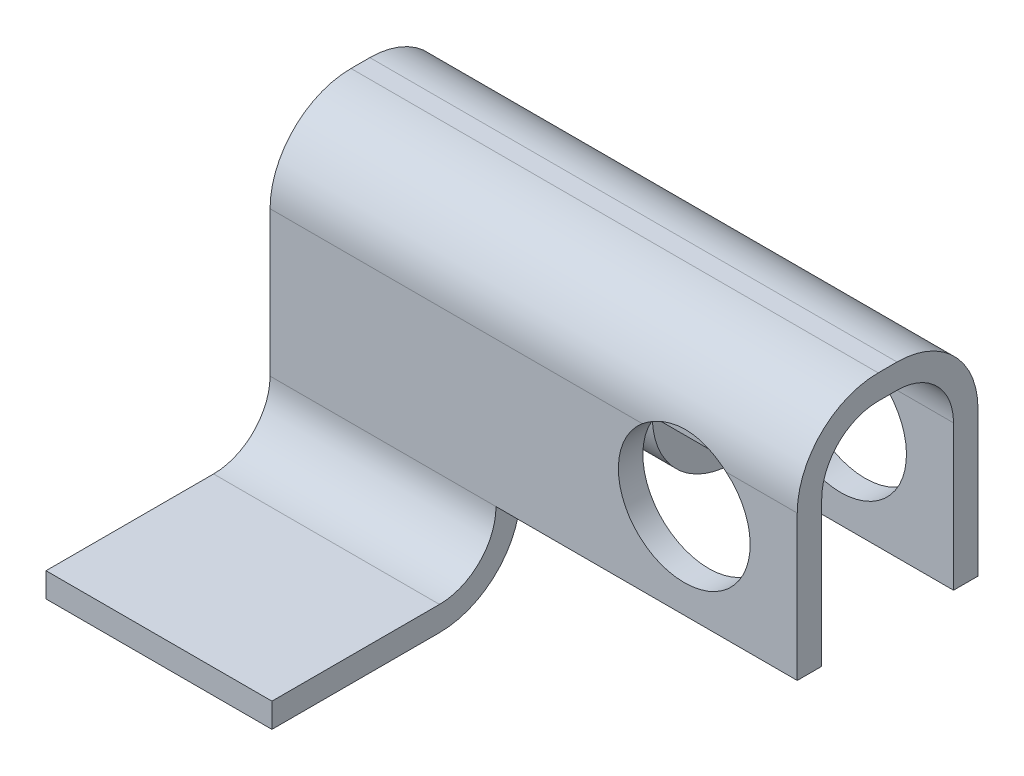
ISO-10303-21;
HEADER;
FILE_DESCRIPTION(('STEP AP214'),'2;1');
FILE_NAME('part.step','',(''),(''),'','','');
FILE_SCHEMA(('AUTOMOTIVE_DESIGN { 1 0 10303 214 1 1 1 1 }'));
ENDSEC;
DATA;
#1=APPLICATION_CONTEXT('core data for automotive mechanical design processes');
#2=APPLICATION_PROTOCOL_DEFINITION('international standard','automotive_design',2000,#1);
#3=PRODUCT_CONTEXT('',#1,'mechanical');
#4=PRODUCT('Part','Part','',(#3));
#5=PRODUCT_RELATED_PRODUCT_CATEGORY('part','',(#4));
#6=PRODUCT_DEFINITION_FORMATION('','',#4);
#7=PRODUCT_DEFINITION_CONTEXT('part definition',#1,'design');
#8=PRODUCT_DEFINITION('design','',#6,#7);
#9=PRODUCT_DEFINITION_SHAPE('','',#8);
#10=(LENGTH_UNIT() NAMED_UNIT(*) SI_UNIT(.MILLI.,.METRE.));
#11=(NAMED_UNIT(*) PLANE_ANGLE_UNIT() SI_UNIT($,.RADIAN.));
#12=(NAMED_UNIT(*) SI_UNIT($,.STERADIAN.) SOLID_ANGLE_UNIT());
#13=UNCERTAINTY_MEASURE_WITH_UNIT(LENGTH_MEASURE(1.E-05),#10,'distance_accuracy_value','');
#14=(GEOMETRIC_REPRESENTATION_CONTEXT(3) GLOBAL_UNCERTAINTY_ASSIGNED_CONTEXT((#13)) GLOBAL_UNIT_ASSIGNED_CONTEXT((#10,
#11,#12)) REPRESENTATION_CONTEXT('',''));
#15=CARTESIAN_POINT('',(0.,0.,0.));
#16=DIRECTION('',(0.,0.,1.));
#17=DIRECTION('',(1.,0.,0.));
#18=AXIS2_PLACEMENT_3D('',#15,#16,#17);
#19=CARTESIAN_POINT('',(14.,4.3,4.8));
#20=DIRECTION('',(0.,0.,-1.));
#21=DIRECTION('',(-1.,0.,0.));
#22=AXIS2_PLACEMENT_3D('',#19,#20,#21);
#23=PLANE('',#22);
#24=CARTESIAN_POINT('',(8.,9.3,4.8));
#25=DIRECTION('',(0.,0.,1.));
#26=DIRECTION('',(1.,0.,0.));
#27=AXIS2_PLACEMENT_3D('',#24,#25,#26);
#28=CIRCLE('',#27,3.5);
#29=CARTESIAN_POINT('',(5.77289425486799,12.,4.8));
#30=VERTEX_POINT('',#29);
#31=CARTESIAN_POINT('',(10.227105745132,12.,4.8));
#32=VERTEX_POINT('',#31);
#33=EDGE_CURVE('E64',#30,#32,#28,.T.);
#34=ORIENTED_EDGE('',*,*,#33,.F.);
#35=DIRECTION('',(-1.,0.,0.));
#36=VECTOR('',#35,1.);
#37=CARTESIAN_POINT('',(14.,12.,4.8));
#38=LINE('',#37,#36);
#39=CARTESIAN_POINT('',(-14.,12.,4.8));
#40=VERTEX_POINT('',#39);
#41=EDGE_CURVE('E280',#30,#40,#38,.T.);
#42=ORIENTED_EDGE('',*,*,#41,.T.);
#43=DIRECTION('',(0.,1.,0.));
#44=VECTOR('',#43,1.);
#45=CARTESIAN_POINT('',(-14.,4.3,4.8));
#46=LINE('',#45,#44);
#47=CARTESIAN_POINT('',(-14.,4.3,4.8));
#48=VERTEX_POINT('',#47);
#49=EDGE_CURVE('E402',#40,#48,#46,.F.);
#50=ORIENTED_EDGE('',*,*,#49,.T.);
#51=DIRECTION('',(-1.,0.,0.));
#52=VECTOR('',#51,1.);
#53=CARTESIAN_POINT('',(14.,4.3,4.8));
#54=LINE('',#53,#52);
#55=CARTESIAN_POINT('',(-2.,4.3,4.8));
#56=VERTEX_POINT('',#55);
#57=EDGE_CURVE('E298',#56,#48,#54,.T.);
#58=ORIENTED_EDGE('',*,*,#57,.F.);
#59=CARTESIAN_POINT('',(14.,4.3,4.8));
#60=VERTEX_POINT('',#59);
#61=EDGE_CURVE('E293',#60,#56,#54,.T.);
#62=ORIENTED_EDGE('',*,*,#61,.F.);
#63=DIRECTION('',(0.,1.,0.));
#64=VECTOR('',#63,1.);
#65=CARTESIAN_POINT('',(14.,4.3,4.8));
#66=LINE('',#65,#64);
#67=CARTESIAN_POINT('',(14.,12.,4.8));
#68=VERTEX_POINT('',#67);
#69=EDGE_CURVE('E386',#68,#60,#66,.F.);
#70=ORIENTED_EDGE('',*,*,#69,.F.);
#71=EDGE_CURVE('E283',#68,#32,#38,.T.);
#72=ORIENTED_EDGE('',*,*,#71,.T.);
#73=EDGE_LOOP('',(#34,#42,#50,#58,#62,#70,#72));
#74=FACE_BOUND('',#73,.T.);
#75=ADVANCED_FACE('F41',(#74),#23,.F.);
#76=CARTESIAN_POINT('',(14.,1.3,16.7));
#77=DIRECTION('',(0.,-1.,0.));
#78=DIRECTION('',(0.,0.,-1.));
#79=AXIS2_PLACEMENT_3D('',#76,#77,#78);
#80=PLANE('',#79);
#81=DIRECTION('',(-1.,0.,0.));
#82=VECTOR('',#81,1.);
#83=CARTESIAN_POINT('',(14.,1.3,16.7));
#84=LINE('',#83,#82);
#85=CARTESIAN_POINT('',(-2.,1.3,16.7));
#86=VERTEX_POINT('',#85);
#87=CARTESIAN_POINT('',(-14.,1.3,16.7));
#88=VERTEX_POINT('',#87);
#89=EDGE_CURVE('E361',#86,#88,#84,.T.);
#90=ORIENTED_EDGE('',*,*,#89,.F.);
#91=DIRECTION('',(0.,0.,-1.));
#92=VECTOR('',#91,1.);
#93=CARTESIAN_POINT('',(-2.,1.3,16.7));
#94=LINE('',#93,#92);
#95=CARTESIAN_POINT('',(-2.,1.3,7.8));
#96=VERTEX_POINT('',#95);
#97=EDGE_CURVE('E513',#86,#96,#94,.T.);
#98=ORIENTED_EDGE('',*,*,#97,.T.);
#99=DIRECTION('',(-1.,0.,0.));
#100=VECTOR('',#99,1.);
#101=CARTESIAN_POINT('',(14.,1.3,7.8));
#102=LINE('',#101,#100);
#103=CARTESIAN_POINT('',(-14.,1.3,7.8));
#104=VERTEX_POINT('',#103);
#105=EDGE_CURVE('E432',#96,#104,#102,.T.);
#106=ORIENTED_EDGE('',*,*,#105,.T.);
#107=DIRECTION('',(0.,0.,-1.));
#108=VECTOR('',#107,1.);
#109=CARTESIAN_POINT('',(-14.,1.3,16.7));
#110=LINE('',#109,#108);
#111=EDGE_CURVE('E433',#104,#88,#110,.F.);
#112=ORIENTED_EDGE('',*,*,#111,.T.);
#113=EDGE_LOOP('',(#90,#98,#106,#112));
#114=FACE_BOUND('',#113,.T.);
#115=ADVANCED_FACE('F43',(#114),#80,.F.);
#116=CARTESIAN_POINT('',(14.,0.,16.7));
#117=DIRECTION('',(0.,0.,1.));
#118=DIRECTION('',(1.,0.,0.));
#119=AXIS2_PLACEMENT_3D('',#116,#117,#118);
#120=PLANE('',#119);
#121=DIRECTION('',(0.,1.,0.));
#122=VECTOR('',#121,1.);
#123=CARTESIAN_POINT('',(-2.,0.,16.7));
#124=LINE('',#123,#122);
#125=CARTESIAN_POINT('',(-2.,0.,16.7));
#126=VERTEX_POINT('',#125);
#127=EDGE_CURVE('E518',#126,#86,#124,.T.);
#128=ORIENTED_EDGE('',*,*,#127,.T.);
#129=ORIENTED_EDGE('',*,*,#89,.T.);
#130=DIRECTION('',(0.,1.,0.));
#131=VECTOR('',#130,1.);
#132=CARTESIAN_POINT('',(-14.,0.,16.7));
#133=LINE('',#132,#131);
#134=CARTESIAN_POINT('',(-14.,0.,16.7));
#135=VERTEX_POINT('',#134);
#136=EDGE_CURVE('E437',#135,#88,#133,.T.);
#137=ORIENTED_EDGE('',*,*,#136,.F.);
#138=DIRECTION('',(-1.,0.,0.));
#139=VECTOR('',#138,1.);
#140=CARTESIAN_POINT('',(14.,0.,16.7));
#141=LINE('',#140,#139);
#142=EDGE_CURVE('E358',#126,#135,#141,.T.);
#143=ORIENTED_EDGE('',*,*,#142,.F.);
#144=EDGE_LOOP('',(#128,#129,#137,#143));
#145=FACE_BOUND('',#144,.T.);
#146=ADVANCED_FACE('F516',(#145),#120,.T.);
#147=CARTESIAN_POINT('',(14.,0.,16.7));
#148=DIRECTION('',(0.,-1.,0.));
#149=DIRECTION('',(0.,0.,-1.));
#150=AXIS2_PLACEMENT_3D('',#147,#148,#149);
#151=PLANE('',#150);
#152=DIRECTION('',(0.,0.,1.));
#153=VECTOR('',#152,1.);
#154=CARTESIAN_POINT('',(-2.,0.,16.7));
#155=LINE('',#154,#153);
#156=CARTESIAN_POINT('',(-2.,0.,7.8));
#157=VERTEX_POINT('',#156);
#158=EDGE_CURVE('E529',#157,#126,#155,.T.);
#159=ORIENTED_EDGE('',*,*,#158,.T.);
#160=ORIENTED_EDGE('',*,*,#142,.T.);
#161=DIRECTION('',(0.,0.,1.));
#162=VECTOR('',#161,1.);
#163=CARTESIAN_POINT('',(-14.,0.,16.7));
#164=LINE('',#163,#162);
#165=CARTESIAN_POINT('',(-14.,0.,7.8));
#166=VERTEX_POINT('',#165);
#167=EDGE_CURVE('E441',#166,#135,#164,.T.);
#168=ORIENTED_EDGE('',*,*,#167,.F.);
#169=DIRECTION('',(-1.,0.,0.));
#170=VECTOR('',#169,1.);
#171=CARTESIAN_POINT('',(14.,0.,7.8));
#172=LINE('',#171,#170);
#173=EDGE_CURVE('E355',#157,#166,#172,.T.);
#174=ORIENTED_EDGE('',*,*,#173,.F.);
#175=EDGE_LOOP('',(#159,#160,#168,#174));
#176=FACE_BOUND('',#175,.T.);
#177=ADVANCED_FACE('F672',(#176),#151,.T.);
#178=CARTESIAN_POINT('',(14.,4.3,7.8));
#179=DIRECTION('',(-1.,0.,0.));
#180=DIRECTION('',(0.,0.,1.));
#181=AXIS2_PLACEMENT_3D('',#178,#179,#180);
#182=CYLINDRICAL_SURFACE('',#181,4.3);
#183=CARTESIAN_POINT('',(-2.,4.3,7.8));
#184=DIRECTION('',(-1.,0.,0.));
#185=DIRECTION('',(0.,0.,1.));
#186=AXIS2_PLACEMENT_3D('',#183,#184,#185);
#187=CIRCLE('',#186,4.3);
#188=CARTESIAN_POINT('',(-2.,4.3,3.5));
#189=VERTEX_POINT('',#188);
#190=EDGE_CURVE('E405',#157,#189,#187,.F.);
#191=ORIENTED_EDGE('',*,*,#190,.F.);
#192=ORIENTED_EDGE('',*,*,#173,.T.);
#193=CARTESIAN_POINT('',(-14.,4.3,7.8));
#194=DIRECTION('',(-1.,0.,0.));
#195=DIRECTION('',(0.,0.,-1.));
#196=AXIS2_PLACEMENT_3D('',#193,#194,#195);
#197=CIRCLE('',#196,4.3);
#198=CARTESIAN_POINT('',(-14.,4.3,3.5));
#199=VERTEX_POINT('',#198);
#200=EDGE_CURVE('E445',#199,#166,#197,.T.);
#201=ORIENTED_EDGE('',*,*,#200,.F.);
#202=DIRECTION('',(-1.,0.,0.));
#203=VECTOR('',#202,1.);
#204=CARTESIAN_POINT('',(14.,4.3,3.5));
#205=LINE('',#204,#203);
#206=EDGE_CURVE('E350',#189,#199,#205,.T.);
#207=ORIENTED_EDGE('',*,*,#206,.F.);
#208=EDGE_LOOP('',(#191,#192,#201,#207));
#209=FACE_BOUND('',#208,.T.);
#210=ADVANCED_FACE('F558',(#209),#182,.T.);
#211=CARTESIAN_POINT('',(14.,4.3,3.5));
#212=DIRECTION('',(0.,0.,-1.));
#213=DIRECTION('',(-1.,0.,0.));
#214=AXIS2_PLACEMENT_3D('',#211,#212,#213);
#215=PLANE('',#214);
#216=CARTESIAN_POINT('',(8.,9.3,3.5));
#217=DIRECTION('',(0.,0.,-1.));
#218=DIRECTION('',(-1.,0.,0.));
#219=AXIS2_PLACEMENT_3D('',#216,#217,#218);
#220=CIRCLE('',#219,3.5);
#221=CARTESIAN_POINT('',(10.227105745132,12.,3.5));
#222=VERTEX_POINT('',#221);
#223=CARTESIAN_POINT('',(5.772894254868,12.,3.5));
#224=VERTEX_POINT('',#223);
#225=EDGE_CURVE('E570',#222,#224,#220,.T.);
#226=ORIENTED_EDGE('',*,*,#225,.F.);
#227=DIRECTION('',(-1.,0.,0.));
#228=VECTOR('',#227,1.);
#229=CARTESIAN_POINT('',(14.,12.,3.5));
#230=LINE('',#229,#228);
#231=CARTESIAN_POINT('',(14.,12.,3.5));
#232=VERTEX_POINT('',#231);
#233=EDGE_CURVE('E346',#232,#222,#230,.T.);
#234=ORIENTED_EDGE('',*,*,#233,.F.);
#235=DIRECTION('',(0.,-1.,0.));
#236=VECTOR('',#235,1.);
#237=CARTESIAN_POINT('',(14.,4.3,3.5));
#238=LINE('',#237,#236);
#239=CARTESIAN_POINT('',(14.,4.3,3.5));
#240=VERTEX_POINT('',#239);
#241=EDGE_CURVE('E384',#232,#240,#238,.T.);
#242=ORIENTED_EDGE('',*,*,#241,.T.);
#243=EDGE_CURVE('E351',#240,#189,#205,.T.);
#244=ORIENTED_EDGE('',*,*,#243,.T.);
#245=ORIENTED_EDGE('',*,*,#206,.T.);
#246=DIRECTION('',(0.,-1.,0.));
#247=VECTOR('',#246,1.);
#248=CARTESIAN_POINT('',(-14.,4.3,3.5));
#249=LINE('',#248,#247);
#250=CARTESIAN_POINT('',(-14.,12.,3.5));
#251=VERTEX_POINT('',#250);
#252=EDGE_CURVE('E449',#251,#199,#249,.T.);
#253=ORIENTED_EDGE('',*,*,#252,.F.);
#254=EDGE_CURVE('E345',#224,#251,#230,.T.);
#255=ORIENTED_EDGE('',*,*,#254,.F.);
#256=EDGE_LOOP('',(#226,#234,#242,#244,#245,#253,#255));
#257=FACE_BOUND('',#256,.T.);
#258=ADVANCED_FACE('F391',(#257),#215,.T.);
#259=CARTESIAN_POINT('',(14.,12.,0.5));
#260=DIRECTION('',(-1.,0.,0.));
#261=DIRECTION('',(0.,0.,1.));
#262=AXIS2_PLACEMENT_3D('',#259,#260,#261);
#263=CYLINDRICAL_SURFACE('',#262,3.);
#264=CARTESIAN_POINT('',(5.772894254868,12.,3.5));
#265=CARTESIAN_POINT('',(5.84796690042875,12.0619384017295,3.49998885328652));
#266=CARTESIAN_POINT('',(5.9256066170269,12.1207038565759,3.49808180727599));
#267=CARTESIAN_POINT('',(6.08539011545105,12.2315003259171,3.49157195603899));
#268=CARTESIAN_POINT('',(6.1675314978076,12.2835348793454,3.48697057451579));
#269=CARTESIAN_POINT('',(6.33581209672732,12.380572144154,3.47616298584188));
#270=CARTESIAN_POINT('',(6.42195335114828,12.4255712189601,3.46995595311597));
#271=CARTESIAN_POINT('',(6.59764903722375,12.5082451721521,3.45693083087825));
#272=CARTESIAN_POINT('',(6.68720388829673,12.5459191470328,3.45011266613847));
#273=CARTESIAN_POINT('',(6.86909883189998,12.6136802010811,3.43676505906119));
#274=CARTESIAN_POINT('',(6.96143720740045,12.6437718543924,3.4302354446218));
#275=CARTESIAN_POINT('',(7.14835757879908,12.6961928524743,3.41822542875842));
#276=CARTESIAN_POINT('',(7.24293949119757,12.7185224856482,3.41274498835505));
#277=CARTESIAN_POINT('',(7.43360402178837,12.755229251285,3.40344412618993));
#278=CARTESIAN_POINT('',(7.5296847797361,12.7696155425664,3.3996217936945));
#279=CARTESIAN_POINT('',(7.72276998303589,12.7903540060962,3.39403810388122));
#280=CARTESIAN_POINT('',(7.819774416712,12.7967062797651,3.39227672054621));
#281=CARTESIAN_POINT('',(8.0137129131286,12.8013129837278,3.39100387375256));
#282=CARTESIAN_POINT('',(8.1106463811826,12.7995905632813,3.39148597843138));
#283=CARTESIAN_POINT('',(8.30399916070207,12.7881178647135,3.39463378776338));
#284=CARTESIAN_POINT('',(8.40041846428964,12.7783674639433,3.3972995257774));
#285=CARTESIAN_POINT('',(8.59218753600681,12.7508989712738,3.40454019739066));
#286=CARTESIAN_POINT('',(8.68753561215619,12.7331697102432,3.40911780665605));
#287=CARTESIAN_POINT('',(8.87632310772877,12.6899048096135,3.41967785901132));
#288=CARTESIAN_POINT('',(8.96976256412049,12.6643693213683,3.42566027486308));
#289=CARTESIAN_POINT('',(9.24503006707725,12.5766905290595,3.444663674751));
#290=CARTESIAN_POINT('',(9.42338099924917,12.503246905692,3.45881918194043));
#291=CARTESIAN_POINT('',(9.67975291308119,12.3720793947057,3.47715801707161));
#292=CARTESIAN_POINT('',(9.7632842391686,12.3249059965885,3.48278496755195));
#293=CARTESIAN_POINT('',(9.92626858348999,12.2238081502256,3.49207174860834));
#294=CARTESIAN_POINT('',(10.0057238122775,12.16988741696,3.4957326558332));
#295=CARTESIAN_POINT('',(10.131903851002,12.0764598247996,3.4992446622574));
#296=CARTESIAN_POINT('',(10.1800180228962,12.0388476397168,3.49999733964808));
#297=CARTESIAN_POINT('',(10.227105745132,12.,3.5));
#298=B_SPLINE_CURVE_WITH_KNOTS('',3,(#264,#265,#266,#267,#268,#269,#270,#271,#272,#273,#274,
#275,#276,#277,#278,#279,#280,#281,#282,#283,#284,#285,#286,#287,#288,#289,#290,#291,#292,#293,
#294,#295,#296,#297),.UNSPECIFIED.,.F.,.F.,(4,2,2,2,2,2,2,2,2,2,2,2,2,2,2,2,4),(0.,
0.291819044565795,0.583484029146515,0.875299277775188,1.16715049718602,1.45882522937467,
1.75048912303015,2.04181601684805,2.33313923295286,2.62362776903662,2.91412074319535,
3.20502163216398,3.49591688125082,4.072986554689,4.36102755871018,4.64891066383744,
4.83203860166615),.UNSPECIFIED.);
#299=EDGE_CURVE('E567',#224,#222,#298,.T.);
#300=ORIENTED_EDGE('',*,*,#299,.F.);
#301=ORIENTED_EDGE('',*,*,#254,.T.);
#302=CARTESIAN_POINT('',(-14.,12.,0.5));
#303=DIRECTION('',(1.,0.,0.));
#304=DIRECTION('',(0.,0.,1.));
#305=AXIS2_PLACEMENT_3D('',#302,#303,#304);
#306=CIRCLE('',#305,3.);
#307=CARTESIAN_POINT('',(-14.,15.,0.5));
#308=VERTEX_POINT('',#307);
#309=EDGE_CURVE('E453',#308,#251,#306,.T.);
#310=ORIENTED_EDGE('',*,*,#309,.F.);
#311=DIRECTION('',(-1.,0.,0.));
#312=VECTOR('',#311,1.);
#313=CARTESIAN_POINT('',(14.,15.,0.5));
#314=LINE('',#313,#312);
#315=CARTESIAN_POINT('',(14.,15.,0.5));
#316=VERTEX_POINT('',#315);
#317=EDGE_CURVE('E342',#316,#308,#314,.T.);
#318=ORIENTED_EDGE('',*,*,#317,.F.);
#319=CARTESIAN_POINT('',(14.,12.,0.5));
#320=DIRECTION('',(1.,0.,0.));
#321=DIRECTION('',(0.,0.,1.));
#322=AXIS2_PLACEMENT_3D('',#319,#320,#321);
#323=CIRCLE('',#322,3.);
#324=EDGE_CURVE('E393',#316,#232,#323,.T.);
#325=ORIENTED_EDGE('',*,*,#324,.T.);
#326=ORIENTED_EDGE('',*,*,#233,.T.);
#327=EDGE_LOOP('',(#300,#301,#310,#318,#325,#326));
#328=FACE_BOUND('',#327,.T.);
#329=ADVANCED_FACE('F566',(#328),#263,.F.);
#330=CARTESIAN_POINT('',(14.,15.,0.5));
#331=DIRECTION('',(0.,-1.,0.));
#332=DIRECTION('',(0.,0.,-1.));
#333=AXIS2_PLACEMENT_3D('',#330,#331,#332);
#334=PLANE('',#333);
#335=DIRECTION('',(0.,0.,1.));
#336=VECTOR('',#335,1.);
#337=CARTESIAN_POINT('',(-14.,15.,0.5));
#338=LINE('',#337,#336);
#339=CARTESIAN_POINT('',(-14.,15.,-0.5));
#340=VERTEX_POINT('',#339);
#341=EDGE_CURVE('E457',#340,#308,#338,.T.);
#342=ORIENTED_EDGE('',*,*,#341,.F.);
#343=DIRECTION('',(-1.,0.,0.));
#344=VECTOR('',#343,1.);
#345=CARTESIAN_POINT('',(14.,15.,-0.5));
#346=LINE('',#345,#344);
#347=CARTESIAN_POINT('',(14.,15.,-0.5));
#348=VERTEX_POINT('',#347);
#349=EDGE_CURVE('E339',#348,#340,#346,.T.);
#350=ORIENTED_EDGE('',*,*,#349,.F.);
#351=DIRECTION('',(0.,0.,1.));
#352=VECTOR('',#351,1.);
#353=CARTESIAN_POINT('',(14.,15.,0.5));
#354=LINE('',#353,#352);
#355=EDGE_CURVE('E398',#348,#316,#354,.T.);
#356=ORIENTED_EDGE('',*,*,#355,.T.);
#357=ORIENTED_EDGE('',*,*,#317,.T.);
#358=EDGE_LOOP('',(#342,#350,#356,#357));
#359=FACE_BOUND('',#358,.T.);
#360=ADVANCED_FACE('F606',(#359),#334,.T.);
#361=CARTESIAN_POINT('',(14.,12.,-0.5));
#362=DIRECTION('',(-1.,0.,0.));
#363=DIRECTION('',(0.,0.,1.));
#364=AXIS2_PLACEMENT_3D('',#361,#362,#363);
#365=CYLINDRICAL_SURFACE('',#364,3.);
#366=CARTESIAN_POINT('',(10.227105745132,12.,-3.5));
#367=CARTESIAN_POINT('',(10.1520330995713,12.0619384017295,-3.49998885328652));
#368=CARTESIAN_POINT('',(10.0743933829731,12.1207038565759,-3.49808180727599));
#369=CARTESIAN_POINT('',(9.91460988454895,12.2315003259171,-3.49157195603899));
#370=CARTESIAN_POINT('',(9.8324685021924,12.2835348793454,-3.48697057451579));
#371=CARTESIAN_POINT('',(9.66418790327268,12.380572144154,-3.47616298584188));
#372=CARTESIAN_POINT('',(9.57804664885172,12.4255712189601,-3.46995595311597));
#373=CARTESIAN_POINT('',(9.40235096277625,12.5082451721521,-3.45693083087825));
#374=CARTESIAN_POINT('',(9.31279611170327,12.5459191470328,-3.45011266613847));
#375=CARTESIAN_POINT('',(9.13090116810002,12.6136802010811,-3.43676505906119));
#376=CARTESIAN_POINT('',(9.03856279259955,12.6437718543924,-3.4302354446218));
#377=CARTESIAN_POINT('',(8.85164242120092,12.6961928524743,-3.41822542875842));
#378=CARTESIAN_POINT('',(8.75706050880243,12.7185224856482,-3.41274498835505));
#379=CARTESIAN_POINT('',(8.56639597821163,12.755229251285,-3.40344412618993));
#380=CARTESIAN_POINT('',(8.4703152202639,12.7696155425664,-3.3996217936945));
#381=CARTESIAN_POINT('',(8.27723001696411,12.7903540060962,-3.39403810388122));
#382=CARTESIAN_POINT('',(8.180225583288,12.7967062797651,-3.39227672054621));
#383=CARTESIAN_POINT('',(7.9862870868714,12.8013129837278,-3.39100387375256));
#384=CARTESIAN_POINT('',(7.8893536188174,12.7995905632813,-3.39148597843138));
#385=CARTESIAN_POINT('',(7.69600083929793,12.7881178647135,-3.39463378776338));
#386=CARTESIAN_POINT('',(7.59958153571036,12.7783674639433,-3.3972995257774));
#387=CARTESIAN_POINT('',(7.40781246399319,12.7508989712738,-3.40454019739066));
#388=CARTESIAN_POINT('',(7.31246438784381,12.7331697102432,-3.40911780665605));
#389=CARTESIAN_POINT('',(7.12367689227123,12.6899048096135,-3.41967785901132));
#390=CARTESIAN_POINT('',(7.03023743587951,12.6643693213683,-3.42566027486308));
#391=CARTESIAN_POINT('',(6.75496993292275,12.5766905290595,-3.444663674751));
#392=CARTESIAN_POINT('',(6.57661900075084,12.503246905692,-3.45881918194043));
#393=CARTESIAN_POINT('',(6.32024708691881,12.3720793947057,-3.47715801707161));
#394=CARTESIAN_POINT('',(6.2367157608314,12.3249059965885,-3.48278496755194));
#395=CARTESIAN_POINT('',(6.07373141651001,12.2238081502256,-3.49207174860834));
#396=CARTESIAN_POINT('',(5.99427618772251,12.16988741696,-3.4957326558332));
#397=CARTESIAN_POINT('',(5.86809614899796,12.0764598247996,-3.4992446622574));
#398=CARTESIAN_POINT('',(5.81998197710382,12.0388476397168,-3.49999733964808));
#399=CARTESIAN_POINT('',(5.772894254868,12.,-3.5));
#400=B_SPLINE_CURVE_WITH_KNOTS('',3,(#366,#367,#368,#369,#370,#371,#372,#373,#374,#375,#376,
#377,#378,#379,#380,#381,#382,#383,#384,#385,#386,#387,#388,#389,#390,#391,#392,#393,#394,#395,
#396,#397,#398,#399),.UNSPECIFIED.,.F.,.F.,(4,2,2,2,2,2,2,2,2,2,2,2,2,2,2,2,4),(0.,
0.291819044565798,0.583484029146515,0.875299277775189,1.16715049718602,1.45882522937467,
1.75048912303015,2.04181601684805,2.33313923295286,2.62362776903662,2.91412074319535,
3.20502163216398,3.49591688125082,4.072986554689,4.36102755871018,4.64891066383744,
4.83203860166615),.UNSPECIFIED.);
#401=CARTESIAN_POINT('',(10.227105745132,12.,-3.5));
#402=VERTEX_POINT('',#401);
#403=CARTESIAN_POINT('',(5.772894254868,12.,-3.5));
#404=VERTEX_POINT('',#403);
#405=EDGE_CURVE('E574',#402,#404,#400,.T.);
#406=ORIENTED_EDGE('',*,*,#405,.F.);
#407=DIRECTION('',(-1.,0.,0.));
#408=VECTOR('',#407,1.);
#409=CARTESIAN_POINT('',(14.,12.,-3.5));
#410=LINE('',#409,#408);
#411=CARTESIAN_POINT('',(14.,12.,-3.5));
#412=VERTEX_POINT('',#411);
#413=EDGE_CURVE('E335',#412,#402,#410,.T.);
#414=ORIENTED_EDGE('',*,*,#413,.F.);
#415=CARTESIAN_POINT('',(14.,12.,-0.5));
#416=DIRECTION('',(1.,0.,0.));
#417=DIRECTION('',(0.,0.,-1.));
#418=AXIS2_PLACEMENT_3D('',#415,#416,#417);
#419=CIRCLE('',#418,3.);
#420=EDGE_CURVE('E411',#412,#348,#419,.T.);
#421=ORIENTED_EDGE('',*,*,#420,.T.);
#422=ORIENTED_EDGE('',*,*,#349,.T.);
#423=CARTESIAN_POINT('',(-14.,12.,-0.5));
#424=DIRECTION('',(1.,0.,0.));
#425=DIRECTION('',(0.,0.,-1.));
#426=AXIS2_PLACEMENT_3D('',#423,#424,#425);
#427=CIRCLE('',#426,3.);
#428=CARTESIAN_POINT('',(-14.,12.,-3.5));
#429=VERTEX_POINT('',#428);
#430=EDGE_CURVE('E461',#429,#340,#427,.T.);
#431=ORIENTED_EDGE('',*,*,#430,.F.);
#432=EDGE_CURVE('E334',#404,#429,#410,.T.);
#433=ORIENTED_EDGE('',*,*,#432,.F.);
#434=EDGE_LOOP('',(#406,#414,#421,#422,#431,#433));
#435=FACE_BOUND('',#434,.T.);
#436=ADVANCED_FACE('F601',(#435),#365,.F.);
#437=CARTESIAN_POINT('',(14.,4.3,-3.5));
#438=DIRECTION('',(0.,0.,1.));
#439=DIRECTION('',(1.,0.,0.));
#440=AXIS2_PLACEMENT_3D('',#437,#438,#439);
#441=PLANE('',#440);
#442=CARTESIAN_POINT('',(8.,9.3,-3.5));
#443=DIRECTION('',(0.,0.,1.));
#444=DIRECTION('',(1.,0.,0.));
#445=AXIS2_PLACEMENT_3D('',#442,#443,#444);
#446=CIRCLE('',#445,3.5);
#447=EDGE_CURVE('E74',#404,#402,#446,.T.);
#448=ORIENTED_EDGE('',*,*,#447,.F.);
#449=ORIENTED_EDGE('',*,*,#432,.T.);
#450=DIRECTION('',(0.,1.,0.));
#451=VECTOR('',#450,1.);
#452=CARTESIAN_POINT('',(-14.,4.3,-3.5));
#453=LINE('',#452,#451);
#454=CARTESIAN_POINT('',(-14.,4.3,-3.5));
#455=VERTEX_POINT('',#454);
#456=EDGE_CURVE('E465',#455,#429,#453,.T.);
#457=ORIENTED_EDGE('',*,*,#456,.F.);
#458=DIRECTION('',(-1.,0.,0.));
#459=VECTOR('',#458,1.);
#460=CARTESIAN_POINT('',(14.,4.3,-3.5));
#461=LINE('',#460,#459);
#462=CARTESIAN_POINT('',(-2.,4.3,-3.5));
#463=VERTEX_POINT('',#462);
#464=EDGE_CURVE('E330',#463,#455,#461,.T.);
#465=ORIENTED_EDGE('',*,*,#464,.F.);
#466=CARTESIAN_POINT('',(14.,4.3,-3.5));
#467=VERTEX_POINT('',#466);
#468=EDGE_CURVE('E331',#467,#463,#461,.T.);
#469=ORIENTED_EDGE('',*,*,#468,.F.);
#470=DIRECTION('',(0.,1.,0.));
#471=VECTOR('',#470,1.);
#472=CARTESIAN_POINT('',(14.,4.3,-3.5));
#473=LINE('',#472,#471);
#474=EDGE_CURVE('E415',#467,#412,#473,.T.);
#475=ORIENTED_EDGE('',*,*,#474,.T.);
#476=ORIENTED_EDGE('',*,*,#413,.T.);
#477=EDGE_LOOP('',(#448,#449,#457,#465,#469,#475,#476));
#478=FACE_BOUND('',#477,.T.);
#479=ADVANCED_FACE('F605',(#478),#441,.T.);
#480=CARTESIAN_POINT('',(14.,4.3,-7.8));
#481=DIRECTION('',(-1.,0.,0.));
#482=DIRECTION('',(0.,0.,1.));
#483=AXIS2_PLACEMENT_3D('',#480,#481,#482);
#484=CYLINDRICAL_SURFACE('',#483,4.3);
#485=CARTESIAN_POINT('',(-2.,4.3,-7.8));
#486=DIRECTION('',(-1.,0.,0.));
#487=DIRECTION('',(0.,0.,1.));
#488=AXIS2_PLACEMENT_3D('',#485,#486,#487);
#489=CIRCLE('',#488,4.3);
#490=CARTESIAN_POINT('',(-2.,0.,-7.8));
#491=VERTEX_POINT('',#490);
#492=EDGE_CURVE('E541',#463,#491,#489,.F.);
#493=ORIENTED_EDGE('',*,*,#492,.F.);
#494=ORIENTED_EDGE('',*,*,#464,.T.);
#495=CARTESIAN_POINT('',(-14.,4.3,-7.8));
#496=DIRECTION('',(-1.,0.,0.));
#497=DIRECTION('',(0.,0.,-1.));
#498=AXIS2_PLACEMENT_3D('',#495,#496,#497);
#499=CIRCLE('',#498,4.3);
#500=CARTESIAN_POINT('',(-14.,0.,-7.8));
#501=VERTEX_POINT('',#500);
#502=EDGE_CURVE('E469',#501,#455,#499,.T.);
#503=ORIENTED_EDGE('',*,*,#502,.F.);
#504=DIRECTION('',(-1.,0.,0.));
#505=VECTOR('',#504,1.);
#506=CARTESIAN_POINT('',(14.,0.,-7.8));
#507=LINE('',#506,#505);
#508=EDGE_CURVE('E327',#491,#501,#507,.T.);
#509=ORIENTED_EDGE('',*,*,#508,.F.);
#510=EDGE_LOOP('',(#493,#494,#503,#509));
#511=FACE_BOUND('',#510,.T.);
#512=ADVANCED_FACE('F654',(#511),#484,.T.);
#513=CARTESIAN_POINT('',(14.,0.,-16.7));
#514=DIRECTION('',(0.,-1.,0.));
#515=DIRECTION('',(0.,0.,-1.));
#516=AXIS2_PLACEMENT_3D('',#513,#514,#515);
#517=PLANE('',#516);
#518=CARTESIAN_POINT('',(-2.,0.,-16.7));
#519=VERTEX_POINT('',#518);
#520=EDGE_CURVE('E523',#519,#491,#155,.T.);
#521=ORIENTED_EDGE('',*,*,#520,.T.);
#522=ORIENTED_EDGE('',*,*,#508,.T.);
#523=DIRECTION('',(0.,0.,1.));
#524=VECTOR('',#523,1.);
#525=CARTESIAN_POINT('',(-14.,0.,-16.7));
#526=LINE('',#525,#524);
#527=CARTESIAN_POINT('',(-14.,0.,-16.7));
#528=VERTEX_POINT('',#527);
#529=EDGE_CURVE('E473',#528,#501,#526,.T.);
#530=ORIENTED_EDGE('',*,*,#529,.F.);
#531=DIRECTION('',(-1.,0.,0.));
#532=VECTOR('',#531,1.);
#533=CARTESIAN_POINT('',(14.,0.,-16.7));
#534=LINE('',#533,#532);
#535=EDGE_CURVE('E324',#519,#528,#534,.T.);
#536=ORIENTED_EDGE('',*,*,#535,.F.);
#537=EDGE_LOOP('',(#521,#522,#530,#536));
#538=FACE_BOUND('',#537,.T.);
#539=ADVANCED_FACE('F651',(#538),#517,.T.);
#540=CARTESIAN_POINT('',(14.,1.3,-16.7));
#541=DIRECTION('',(0.,0.,-1.));
#542=DIRECTION('',(-1.,0.,0.));
#543=AXIS2_PLACEMENT_3D('',#540,#541,#542);
#544=PLANE('',#543);
#545=DIRECTION('',(0.,1.,0.));
#546=VECTOR('',#545,1.);
#547=CARTESIAN_POINT('',(-2.,0.,-16.7));
#548=LINE('',#547,#546);
#549=CARTESIAN_POINT('',(-2.,1.3,-16.7));
#550=VERTEX_POINT('',#549);
#551=EDGE_CURVE('E522',#519,#550,#548,.T.);
#552=ORIENTED_EDGE('',*,*,#551,.F.);
#553=ORIENTED_EDGE('',*,*,#535,.T.);
#554=DIRECTION('',(0.,-1.,0.));
#555=VECTOR('',#554,1.);
#556=CARTESIAN_POINT('',(-14.,1.3,-16.7));
#557=LINE('',#556,#555);
#558=CARTESIAN_POINT('',(-14.,1.3,-16.7));
#559=VERTEX_POINT('',#558);
#560=EDGE_CURVE('E477',#559,#528,#557,.T.);
#561=ORIENTED_EDGE('',*,*,#560,.F.);
#562=DIRECTION('',(-1.,0.,0.));
#563=VECTOR('',#562,1.);
#564=CARTESIAN_POINT('',(14.,1.3,-16.7));
#565=LINE('',#564,#563);
#566=EDGE_CURVE('E321',#550,#559,#565,.T.);
#567=ORIENTED_EDGE('',*,*,#566,.F.);
#568=EDGE_LOOP('',(#552,#553,#561,#567));
#569=FACE_BOUND('',#568,.T.);
#570=ADVANCED_FACE('F647',(#569),#544,.T.);
#571=CARTESIAN_POINT('',(14.,1.3,-16.7));
#572=DIRECTION('',(0.,-1.,0.));
#573=DIRECTION('',(0.,0.,-1.));
#574=AXIS2_PLACEMENT_3D('',#571,#572,#573);
#575=PLANE('',#574);
#576=DIRECTION('',(-1.,0.,0.));
#577=VECTOR('',#576,1.);
#578=CARTESIAN_POINT('',(14.,1.3,-7.8));
#579=LINE('',#578,#577);
#580=CARTESIAN_POINT('',(-2.,1.3,-7.8));
#581=VERTEX_POINT('',#580);
#582=CARTESIAN_POINT('',(-14.,1.3,-7.8));
#583=VERTEX_POINT('',#582);
#584=EDGE_CURVE('E318',#581,#583,#579,.T.);
#585=ORIENTED_EDGE('',*,*,#584,.F.);
#586=DIRECTION('',(0.,0.,-1.));
#587=VECTOR('',#586,1.);
#588=CARTESIAN_POINT('',(-2.,1.3,-16.7));
#589=LINE('',#588,#587);
#590=EDGE_CURVE('E538',#581,#550,#589,.T.);
#591=ORIENTED_EDGE('',*,*,#590,.T.);
#592=ORIENTED_EDGE('',*,*,#566,.T.);
#593=DIRECTION('',(0.,0.,-1.));
#594=VECTOR('',#593,1.);
#595=CARTESIAN_POINT('',(-14.,1.3,-16.7));
#596=LINE('',#595,#594);
#597=EDGE_CURVE('E481',#559,#583,#596,.F.);
#598=ORIENTED_EDGE('',*,*,#597,.T.);
#599=EDGE_LOOP('',(#585,#591,#592,#598));
#600=FACE_BOUND('',#599,.T.);
#601=ADVANCED_FACE('F643',(#600),#575,.F.);
#602=CARTESIAN_POINT('',(14.,4.3,-7.8));
#603=DIRECTION('',(-1.,0.,0.));
#604=DIRECTION('',(0.,0.,1.));
#605=AXIS2_PLACEMENT_3D('',#602,#603,#604);
#606=CYLINDRICAL_SURFACE('',#605,3.);
#607=DIRECTION('',(-1.,0.,0.));
#608=VECTOR('',#607,1.);
#609=CARTESIAN_POINT('',(14.,4.3,-4.8));
#610=LINE('',#609,#608);
#611=CARTESIAN_POINT('',(-2.,4.3,-4.8));
#612=VERTEX_POINT('',#611);
#613=CARTESIAN_POINT('',(-14.,4.3,-4.8));
#614=VERTEX_POINT('',#613);
#615=EDGE_CURVE('E313',#612,#614,#610,.T.);
#616=ORIENTED_EDGE('',*,*,#615,.F.);
#617=CARTESIAN_POINT('',(-2.,4.3,-7.8));
#618=DIRECTION('',(-1.,0.,0.));
#619=DIRECTION('',(0.,0.,1.));
#620=AXIS2_PLACEMENT_3D('',#617,#618,#619);
#621=CIRCLE('',#620,3.);
#622=EDGE_CURVE('E534',#612,#581,#621,.F.);
#623=ORIENTED_EDGE('',*,*,#622,.T.);
#624=ORIENTED_EDGE('',*,*,#584,.T.);
#625=CARTESIAN_POINT('',(-14.,4.3,-7.8));
#626=DIRECTION('',(1.,0.,0.));
#627=DIRECTION('',(0.,0.,-1.));
#628=AXIS2_PLACEMENT_3D('',#625,#626,#627);
#629=CIRCLE('',#628,3.);
#630=EDGE_CURVE('E485',#583,#614,#629,.F.);
#631=ORIENTED_EDGE('',*,*,#630,.T.);
#632=EDGE_LOOP('',(#616,#623,#624,#631));
#633=FACE_BOUND('',#632,.T.);
#634=ADVANCED_FACE('F639',(#633),#606,.F.);
#635=CARTESIAN_POINT('',(14.,4.3,-4.8));
#636=DIRECTION('',(0.,0.,1.));
#637=DIRECTION('',(1.,0.,0.));
#638=AXIS2_PLACEMENT_3D('',#635,#636,#637);
#639=PLANE('',#638);
#640=DIRECTION('',(-1.,0.,0.));
#641=VECTOR('',#640,1.);
#642=CARTESIAN_POINT('',(14.,12.,-4.8));
#643=LINE('',#642,#641);
#644=CARTESIAN_POINT('',(5.772894254868,12.,-4.8));
#645=VERTEX_POINT('',#644);
#646=CARTESIAN_POINT('',(-14.,12.,-4.8));
#647=VERTEX_POINT('',#646);
#648=EDGE_CURVE('E308',#645,#647,#643,.T.);
#649=ORIENTED_EDGE('',*,*,#648,.F.);
#650=CARTESIAN_POINT('',(8.,9.3,-4.8));
#651=DIRECTION('',(0.,0.,1.));
#652=DIRECTION('',(1.,0.,0.));
#653=AXIS2_PLACEMENT_3D('',#650,#651,#652);
#654=CIRCLE('',#653,3.5);
#655=CARTESIAN_POINT('',(10.227105745132,12.,-4.8));
#656=VERTEX_POINT('',#655);
#657=EDGE_CURVE('E285',#645,#656,#654,.T.);
#658=ORIENTED_EDGE('',*,*,#657,.T.);
#659=CARTESIAN_POINT('',(14.,12.,-4.8));
#660=VERTEX_POINT('',#659);
#661=EDGE_CURVE('E309',#660,#656,#643,.T.);
#662=ORIENTED_EDGE('',*,*,#661,.F.);
#663=DIRECTION('',(0.,1.,0.));
#664=VECTOR('',#663,1.);
#665=CARTESIAN_POINT('',(14.,4.3,-4.8));
#666=LINE('',#665,#664);
#667=CARTESIAN_POINT('',(14.,4.3,-4.8));
#668=VERTEX_POINT('',#667);
#669=EDGE_CURVE('E418',#668,#660,#666,.T.);
#670=ORIENTED_EDGE('',*,*,#669,.F.);
#671=EDGE_CURVE('E314',#668,#612,#610,.T.);
#672=ORIENTED_EDGE('',*,*,#671,.T.);
#673=ORIENTED_EDGE('',*,*,#615,.T.);
#674=DIRECTION('',(0.,1.,0.));
#675=VECTOR('',#674,1.);
#676=CARTESIAN_POINT('',(-14.,4.3,-4.8));
#677=LINE('',#676,#675);
#678=EDGE_CURVE('E489',#614,#647,#677,.T.);
#679=ORIENTED_EDGE('',*,*,#678,.T.);
#680=EDGE_LOOP('',(#649,#658,#662,#670,#672,#673,#679));
#681=FACE_BOUND('',#680,.T.);
#682=ADVANCED_FACE('F635',(#681),#639,.F.);
#683=CARTESIAN_POINT('',(14.,12.,-0.5));
#684=DIRECTION('',(-1.,0.,0.));
#685=DIRECTION('',(0.,0.,1.));
#686=AXIS2_PLACEMENT_3D('',#683,#684,#685);
#687=CYLINDRICAL_SURFACE('',#686,4.3);
#688=ORIENTED_EDGE('',*,*,#661,.T.);
#689=CARTESIAN_POINT('',(10.227105745132,12.,-4.8));
#690=CARTESIAN_POINT('',(10.1514563306367,12.0624123684116,-4.79999312210473));
#691=CARTESIAN_POINT('',(10.0731896384673,12.1216150938211,-4.7986409752968));
#692=CARTESIAN_POINT('',(9.912027004108,12.23321316794,-4.79403595958931));
#693=CARTESIAN_POINT('',(9.82913237613985,12.2856104353166,-4.79078362783809));
#694=CARTESIAN_POINT('',(9.65928077219301,12.3832423151174,-4.78316738661402));
#695=CARTESIAN_POINT('',(9.57232403586064,12.428477349392,-4.77880354264797));
#696=CARTESIAN_POINT('',(9.39496547897257,12.511490547733,-4.76967353539958));
#697=CARTESIAN_POINT('',(9.30456347450786,12.549268313062,-4.76490735062366));
#698=CARTESIAN_POINT('',(9.02908162735132,12.6510033929324,-4.75099550360005));
#699=CARTESIAN_POINT('',(8.8395688274606,12.7034526168855,-4.74222714588157));
#700=CARTESIAN_POINT('',(8.45451235994983,12.7758899269906,-4.72958172906066));
#701=CARTESIAN_POINT('',(8.25897352439426,12.7959033658537,-4.72570085029833));
#702=CARTESIAN_POINT('',(7.86793970488492,12.8029460927625,-4.7243689948137));
#703=CARTESIAN_POINT('',(7.67244701907883,12.7900919665883,-4.726895290702));
#704=CARTESIAN_POINT('',(7.28631412599478,12.7320335585507,-4.73733142193896));
#705=CARTESIAN_POINT('',(7.09567942918941,12.686794097612,-4.74524711114243));
#706=CARTESIAN_POINT('',(6.72503013555352,12.5653253855229,-4.76311330457511));
#707=CARTESIAN_POINT('',(6.54499265065212,12.4891659560238,-4.77305919931801));
#708=CARTESIAN_POINT('',(6.28658841050407,12.3534738859663,-4.78568404183536));
#709=CARTESIAN_POINT('',(6.20245643752518,12.3047138414132,-4.7895079095283));
#710=CARTESIAN_POINT('',(6.03851286668422,12.2003423186313,-4.79564894816378));
#711=CARTESIAN_POINT('',(5.95869890841135,12.1447346392101,-4.79796695006394));
#712=CARTESIAN_POINT('',(5.84462803309099,12.0579898848492,-4.79969929486327));
#713=CARTESIAN_POINT('',(5.80846710819995,12.0293456573897,-4.79999933972531));
#714=CARTESIAN_POINT('',(5.772894254868,12.,-4.8));
#715=B_SPLINE_CURVE_WITH_KNOTS('',3,(#689,#690,#691,#692,#693,#694,#695,#696,#697,#698,#699,
#700,#701,#702,#703,#704,#705,#706,#707,#708,#709,#710,#711,#712,#713,#714),.UNSPECIFIED.,.F.,
.F.,(4,2,2,2,2,2,2,2,2,2,2,2,4),(0.,0.294085637612471,0.588088182665351,0.882073404728335,
1.17607434181487,1.76353882722603,2.35054391222566,2.93546970006679,3.5210318386979,
4.10527898551637,4.39695026140966,4.6884604520288,4.8268157179905),.UNSPECIFIED.);
#716=EDGE_CURVE('E11',#656,#645,#715,.T.);
#717=ORIENTED_EDGE('',*,*,#716,.T.);
#718=ORIENTED_EDGE('',*,*,#648,.T.);
#719=CARTESIAN_POINT('',(-14.,12.,-0.5));
#720=DIRECTION('',(1.,0.,0.));
#721=DIRECTION('',(0.,0.,-1.));
#722=AXIS2_PLACEMENT_3D('',#719,#720,#721);
#723=CIRCLE('',#722,4.3);
#724=CARTESIAN_POINT('',(-14.,16.3,-0.5));
#725=VERTEX_POINT('',#724);
#726=EDGE_CURVE('E492',#647,#725,#723,.T.);
#727=ORIENTED_EDGE('',*,*,#726,.T.);
#728=DIRECTION('',(-1.,0.,0.));
#729=VECTOR('',#728,1.);
#730=CARTESIAN_POINT('',(14.,16.3,-0.5));
#731=LINE('',#730,#729);
#732=CARTESIAN_POINT('',(14.,16.3,-0.5));
#733=VERTEX_POINT('',#732);
#734=EDGE_CURVE('E304',#733,#725,#731,.T.);
#735=ORIENTED_EDGE('',*,*,#734,.F.);
#736=CARTESIAN_POINT('',(14.,12.,-0.5));
#737=DIRECTION('',(1.,0.,0.));
#738=DIRECTION('',(0.,0.,-1.));
#739=AXIS2_PLACEMENT_3D('',#736,#737,#738);
#740=CIRCLE('',#739,4.3);
#741=EDGE_CURVE('E421',#660,#733,#740,.T.);
#742=ORIENTED_EDGE('',*,*,#741,.F.);
#743=EDGE_LOOP('',(#688,#717,#718,#727,#735,#742));
#744=FACE_BOUND('',#743,.T.);
#745=ADVANCED_FACE('F630',(#744),#687,.T.);
#746=CARTESIAN_POINT('',(14.,16.3,0.5));
#747=DIRECTION('',(0.,-1.,0.));
#748=DIRECTION('',(0.,0.,-1.));
#749=AXIS2_PLACEMENT_3D('',#746,#747,#748);
#750=PLANE('',#749);
#751=DIRECTION('',(0.,0.,-1.));
#752=VECTOR('',#751,1.);
#753=CARTESIAN_POINT('',(-14.,16.3,0.5));
#754=LINE('',#753,#752);
#755=CARTESIAN_POINT('',(-14.,16.3,0.5));
#756=VERTEX_POINT('',#755);
#757=EDGE_CURVE('E495',#725,#756,#754,.F.);
#758=ORIENTED_EDGE('',*,*,#757,.T.);
#759=DIRECTION('',(-1.,0.,0.));
#760=VECTOR('',#759,1.);
#761=CARTESIAN_POINT('',(14.,16.3,0.5));
#762=LINE('',#761,#760);
#763=CARTESIAN_POINT('',(14.,16.3,0.5));
#764=VERTEX_POINT('',#763);
#765=EDGE_CURVE('E296',#764,#756,#762,.T.);
#766=ORIENTED_EDGE('',*,*,#765,.F.);
#767=DIRECTION('',(0.,0.,-1.));
#768=VECTOR('',#767,1.);
#769=CARTESIAN_POINT('',(14.,16.3,0.5));
#770=LINE('',#769,#768);
#771=EDGE_CURVE('E424',#733,#764,#770,.F.);
#772=ORIENTED_EDGE('',*,*,#771,.F.);
#773=ORIENTED_EDGE('',*,*,#734,.T.);
#774=EDGE_LOOP('',(#758,#766,#772,#773));
#775=FACE_BOUND('',#774,.T.);
#776=ADVANCED_FACE('F625',(#775),#750,.F.);
#777=CARTESIAN_POINT('',(14.,12.,0.5));
#778=DIRECTION('',(-1.,0.,0.));
#779=DIRECTION('',(0.,0.,1.));
#780=AXIS2_PLACEMENT_3D('',#777,#778,#779);
#781=CYLINDRICAL_SURFACE('',#780,4.3);
#782=ORIENTED_EDGE('',*,*,#41,.F.);
#783=CARTESIAN_POINT('',(5.772894254868,12.,4.8));
#784=CARTESIAN_POINT('',(5.84854366936327,12.0624123684116,4.79999312210473));
#785=CARTESIAN_POINT('',(5.9268103615327,12.1216150938211,4.7986409752968));
#786=CARTESIAN_POINT('',(6.087972995892,12.23321316794,4.79403595958931));
#787=CARTESIAN_POINT('',(6.17086762386015,12.2856104353166,4.79078362783809));
#788=CARTESIAN_POINT('',(6.34071922780698,12.3832423151174,4.78316738661402));
#789=CARTESIAN_POINT('',(6.42767596413936,12.428477349392,4.77880354264797));
#790=CARTESIAN_POINT('',(6.60503452102743,12.511490547733,4.76967353539958));
#791=CARTESIAN_POINT('',(6.69543652549214,12.549268313062,4.76490735062366));
#792=CARTESIAN_POINT('',(6.97091837264867,12.6510033929324,4.75099550360005));
#793=CARTESIAN_POINT('',(7.1604311725394,12.7034526168855,4.74222714588157));
#794=CARTESIAN_POINT('',(7.54548764005017,12.7758899269906,4.72958172906066));
#795=CARTESIAN_POINT('',(7.74102647560574,12.7959033658537,4.72570085029833));
#796=CARTESIAN_POINT('',(8.13206029511508,12.8029460927625,4.7243689948137));
#797=CARTESIAN_POINT('',(8.32755298092116,12.7900919665883,4.726895290702));
#798=CARTESIAN_POINT('',(8.71368587400522,12.7320335585507,4.73733142193896));
#799=CARTESIAN_POINT('',(8.90432057081058,12.686794097612,4.74524711114243));
#800=CARTESIAN_POINT('',(9.27496986444648,12.5653253855229,4.76311330457511));
#801=CARTESIAN_POINT('',(9.45500734934788,12.4891659560238,4.77305919931801));
#802=CARTESIAN_POINT('',(9.71341158949593,12.3534738859663,4.78568404183536));
#803=CARTESIAN_POINT('',(9.79754356247482,12.3047138414132,4.7895079095283));
#804=CARTESIAN_POINT('',(9.96148713331578,12.2003423186313,4.79564894816378));
#805=CARTESIAN_POINT('',(10.0413010915886,12.1447346392101,4.79796695006394));
#806=CARTESIAN_POINT('',(10.155371966909,12.0579898848492,4.79969929486327));
#807=CARTESIAN_POINT('',(10.1915328918001,12.0293456573897,4.79999933972531));
#808=CARTESIAN_POINT('',(10.227105745132,12.,4.8));
#809=B_SPLINE_CURVE_WITH_KNOTS('',3,(#783,#784,#785,#786,#787,#788,#789,#790,#791,#792,#793,
#794,#795,#796,#797,#798,#799,#800,#801,#802,#803,#804,#805,#806,#807,#808),.UNSPECIFIED.,.F.,
.F.,(4,2,2,2,2,2,2,2,2,2,2,2,4),(0.,0.294085637612471,0.588088182665349,0.882073404728335,
1.17607434181487,1.76353882722603,2.35054391222566,2.93546970006679,3.5210318386979,
4.10527898551637,4.39695026140966,4.6884604520288,4.8268157179905),.UNSPECIFIED.);
#810=EDGE_CURVE('E269',#30,#32,#809,.T.);
#811=ORIENTED_EDGE('',*,*,#810,.T.);
#812=ORIENTED_EDGE('',*,*,#71,.F.);
#813=CARTESIAN_POINT('',(14.,12.,0.5));
#814=DIRECTION('',(1.,0.,0.));
#815=DIRECTION('',(0.,0.,-1.));
#816=AXIS2_PLACEMENT_3D('',#813,#814,#815);
#817=CIRCLE('',#816,4.3);
#818=EDGE_CURVE('E427',#764,#68,#817,.T.);
#819=ORIENTED_EDGE('',*,*,#818,.F.);
#820=ORIENTED_EDGE('',*,*,#765,.T.);
#821=CARTESIAN_POINT('',(-14.,12.,0.5));
#822=DIRECTION('',(1.,0.,0.));
#823=DIRECTION('',(0.,0.,-1.));
#824=AXIS2_PLACEMENT_3D('',#821,#822,#823);
#825=CIRCLE('',#824,4.3);
#826=EDGE_CURVE('E290',#756,#40,#825,.T.);
#827=ORIENTED_EDGE('',*,*,#826,.T.);
#828=EDGE_LOOP('',(#782,#811,#812,#819,#820,#827));
#829=FACE_BOUND('',#828,.T.);
#830=ADVANCED_FACE('F287',(#829),#781,.T.);
#831=CARTESIAN_POINT('',(14.,4.3,7.8));
#832=DIRECTION('',(-1.,0.,0.));
#833=DIRECTION('',(0.,0.,1.));
#834=AXIS2_PLACEMENT_3D('',#831,#832,#833);
#835=CYLINDRICAL_SURFACE('',#834,3.);
#836=ORIENTED_EDGE('',*,*,#105,.F.);
#837=CARTESIAN_POINT('',(-2.,4.3,7.8));
#838=DIRECTION('',(-1.,0.,0.));
#839=DIRECTION('',(0.,0.,1.));
#840=AXIS2_PLACEMENT_3D('',#837,#838,#839);
#841=CIRCLE('',#840,3.);
#842=EDGE_CURVE('E55',#96,#56,#841,.F.);
#843=ORIENTED_EDGE('',*,*,#842,.T.);
#844=ORIENTED_EDGE('',*,*,#57,.T.);
#845=CARTESIAN_POINT('',(-14.,4.3,7.8));
#846=DIRECTION('',(1.,0.,0.));
#847=DIRECTION('',(0.,0.,-1.));
#848=AXIS2_PLACEMENT_3D('',#845,#846,#847);
#849=CIRCLE('',#848,3.);
#850=EDGE_CURVE('E394',#48,#104,#849,.F.);
#851=ORIENTED_EDGE('',*,*,#850,.T.);
#852=EDGE_LOOP('',(#836,#843,#844,#851));
#853=FACE_BOUND('',#852,.T.);
#854=ADVANCED_FACE('F506',(#853),#835,.F.);
#855=CARTESIAN_POINT('',(14.,4.3,7.8));
#856=DIRECTION('',(-1.,0.,0.));
#857=DIRECTION('',(0.,0.,1.));
#858=AXIS2_PLACEMENT_3D('',#855,#856,#857);
#859=PLANE('',#858);
#860=ORIENTED_EDGE('',*,*,#69,.T.);
#861=DIRECTION('',(0.,0.,-1.));
#862=VECTOR('',#861,1.);
#863=CARTESIAN_POINT('',(14.,4.3,7.8));
#864=LINE('',#863,#862);
#865=EDGE_CURVE('E367',#60,#240,#864,.T.);
#866=ORIENTED_EDGE('',*,*,#865,.T.);
#867=ORIENTED_EDGE('',*,*,#241,.F.);
#868=ORIENTED_EDGE('',*,*,#324,.F.);
#869=ORIENTED_EDGE('',*,*,#355,.F.);
#870=ORIENTED_EDGE('',*,*,#420,.F.);
#871=ORIENTED_EDGE('',*,*,#474,.F.);
#872=EDGE_CURVE('E364',#467,#668,#864,.T.);
#873=ORIENTED_EDGE('',*,*,#872,.T.);
#874=ORIENTED_EDGE('',*,*,#669,.T.);
#875=ORIENTED_EDGE('',*,*,#741,.T.);
#876=ORIENTED_EDGE('',*,*,#771,.T.);
#877=ORIENTED_EDGE('',*,*,#818,.T.);
#878=EDGE_LOOP('',(#860,#866,#867,#868,#869,#870,#871,#873,#874,#875,#876,#877));
#879=FACE_BOUND('',#878,.T.);
#880=ADVANCED_FACE('F382',(#879),#859,.F.);
#881=CARTESIAN_POINT('',(-14.,4.3,7.8));
#882=DIRECTION('',(-1.,0.,0.));
#883=DIRECTION('',(0.,0.,1.));
#884=AXIS2_PLACEMENT_3D('',#881,#882,#883);
#885=PLANE('',#884);
#886=ORIENTED_EDGE('',*,*,#111,.F.);
#887=ORIENTED_EDGE('',*,*,#850,.F.);
#888=ORIENTED_EDGE('',*,*,#49,.F.);
#889=ORIENTED_EDGE('',*,*,#826,.F.);
#890=ORIENTED_EDGE('',*,*,#757,.F.);
#891=ORIENTED_EDGE('',*,*,#726,.F.);
#892=ORIENTED_EDGE('',*,*,#678,.F.);
#893=ORIENTED_EDGE('',*,*,#630,.F.);
#894=ORIENTED_EDGE('',*,*,#597,.F.);
#895=ORIENTED_EDGE('',*,*,#560,.T.);
#896=ORIENTED_EDGE('',*,*,#529,.T.);
#897=ORIENTED_EDGE('',*,*,#502,.T.);
#898=ORIENTED_EDGE('',*,*,#456,.T.);
#899=ORIENTED_EDGE('',*,*,#430,.T.);
#900=ORIENTED_EDGE('',*,*,#341,.T.);
#901=ORIENTED_EDGE('',*,*,#309,.T.);
#902=ORIENTED_EDGE('',*,*,#252,.T.);
#903=ORIENTED_EDGE('',*,*,#200,.T.);
#904=ORIENTED_EDGE('',*,*,#167,.T.);
#905=ORIENTED_EDGE('',*,*,#136,.T.);
#906=EDGE_LOOP('',(#886,#887,#888,#889,#890,#891,#892,#893,#894,#895,#896,#897,#898,#899,#900,
#901,#902,#903,#904,#905));
#907=FACE_BOUND('',#906,.T.);
#908=ADVANCED_FACE('F510',(#907),#885,.T.);
#909=CARTESIAN_POINT('',(0.,4.3,0.));
#910=DIRECTION('',(0.,1.,0.));
#911=DIRECTION('',(0.,0.,1.));
#912=AXIS2_PLACEMENT_3D('',#909,#910,#911);
#913=PLANE('',#912);
#914=ORIENTED_EDGE('',*,*,#468,.T.);
#915=DIRECTION('',(0.,0.,1.));
#916=VECTOR('',#915,1.);
#917=CARTESIAN_POINT('',(-2.,4.3,16.7));
#918=LINE('',#917,#916);
#919=EDGE_CURVE('E556',#612,#463,#918,.T.);
#920=ORIENTED_EDGE('',*,*,#919,.F.);
#921=ORIENTED_EDGE('',*,*,#671,.F.);
#922=ORIENTED_EDGE('',*,*,#872,.F.);
#923=EDGE_LOOP('',(#914,#920,#921,#922));
#924=FACE_BOUND('',#923,.T.);
#925=ADVANCED_FACE('F719',(#924),#913,.F.);
#926=CARTESIAN_POINT('',(-2.,0.,16.7));
#927=DIRECTION('',(-1.,0.,0.));
#928=DIRECTION('',(0.,0.,1.));
#929=AXIS2_PLACEMENT_3D('',#926,#927,#928);
#930=PLANE('',#929);
#931=ORIENTED_EDGE('',*,*,#492,.T.);
#932=ORIENTED_EDGE('',*,*,#520,.F.);
#933=ORIENTED_EDGE('',*,*,#551,.T.);
#934=ORIENTED_EDGE('',*,*,#590,.F.);
#935=ORIENTED_EDGE('',*,*,#622,.F.);
#936=ORIENTED_EDGE('',*,*,#919,.T.);
#937=EDGE_LOOP('',(#931,#932,#933,#934,#935,#936));
#938=FACE_BOUND('',#937,.T.);
#939=ADVANCED_FACE('F809',(#938),#930,.F.);
#940=ORIENTED_EDGE('',*,*,#190,.T.);
#941=EDGE_CURVE('E276',#189,#56,#918,.T.);
#942=ORIENTED_EDGE('',*,*,#941,.T.);
#943=ORIENTED_EDGE('',*,*,#842,.F.);
#944=ORIENTED_EDGE('',*,*,#97,.F.);
#945=ORIENTED_EDGE('',*,*,#127,.F.);
#946=ORIENTED_EDGE('',*,*,#158,.F.);
#947=EDGE_LOOP('',(#940,#942,#943,#944,#945,#946));
#948=FACE_BOUND('',#947,.T.);
#949=ADVANCED_FACE('F551',(#948),#930,.F.);
#950=ORIENTED_EDGE('',*,*,#243,.F.);
#951=ORIENTED_EDGE('',*,*,#865,.F.);
#952=ORIENTED_EDGE('',*,*,#61,.T.);
#953=ORIENTED_EDGE('',*,*,#941,.F.);
#954=EDGE_LOOP('',(#950,#951,#952,#953));
#955=FACE_BOUND('',#954,.T.);
#956=ADVANCED_FACE('F555',(#955),#913,.F.);
#957=CARTESIAN_POINT('',(8.,9.3,4.8));
#958=DIRECTION('',(0.,0.,1.));
#959=DIRECTION('',(1.,0.,0.));
#960=AXIS2_PLACEMENT_3D('',#957,#958,#959);
#961=CYLINDRICAL_SURFACE('',#960,3.5);
#962=ORIENTED_EDGE('',*,*,#447,.T.);
#963=ORIENTED_EDGE('',*,*,#405,.T.);
#964=EDGE_LOOP('',(#962,#963));
#965=FACE_BOUND('',#964,.T.);
#966=ORIENTED_EDGE('',*,*,#716,.F.);
#967=ORIENTED_EDGE('',*,*,#657,.F.);
#968=EDGE_LOOP('',(#966,#967));
#969=FACE_BOUND('',#968,.T.);
#970=ADVANCED_FACE('F590',(#965,#969),#961,.F.);
#971=ORIENTED_EDGE('',*,*,#225,.T.);
#972=ORIENTED_EDGE('',*,*,#299,.T.);
#973=EDGE_LOOP('',(#971,#972));
#974=FACE_BOUND('',#973,.T.);
#975=ORIENTED_EDGE('',*,*,#33,.T.);
#976=ORIENTED_EDGE('',*,*,#810,.F.);
#977=EDGE_LOOP('',(#975,#976));
#978=FACE_BOUND('',#977,.T.);
#979=ADVANCED_FACE('F270',(#974,#978),#961,.F.);
#980=CLOSED_SHELL('',(#75,#115,#146,#177,#210,#258,#329,#360,#436,#479,#512,#539,#570,#601,#634,
#682,#745,#776,#830,#854,#880,#908,#925,#939,#949,#956,#970,#979));
#981=MANIFOLD_SOLID_BREP('B2',#980);
#982=ADVANCED_BREP_SHAPE_REPRESENTATION('',(#18,#981),#14);
#983=SHAPE_DEFINITION_REPRESENTATION(#9,#982);
ENDSEC;
END-ISO-10303-21;
